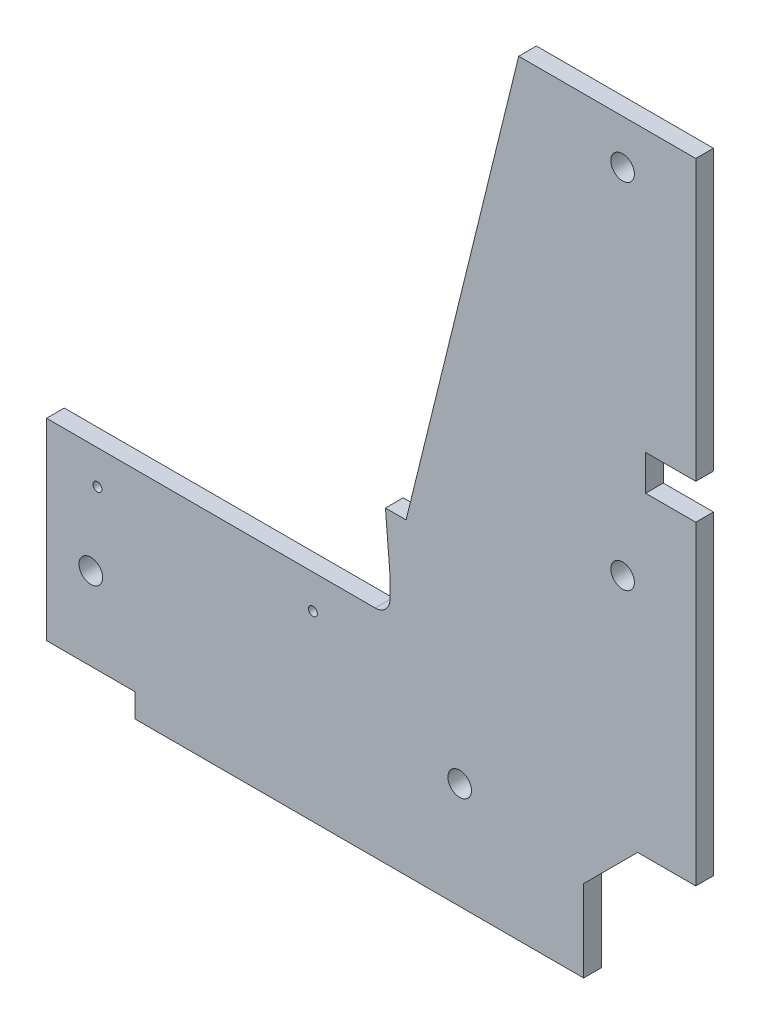
ISO-10303-21;
HEADER;
FILE_DESCRIPTION(('STEP AP214'),'2;1');
FILE_NAME('part.step','',(''),(''),'','','');
FILE_SCHEMA(('AUTOMOTIVE_DESIGN { 1 0 10303 214 1 1 1 1 }'));
ENDSEC;
DATA;
#1=APPLICATION_CONTEXT('core data for automotive mechanical design processes');
#2=APPLICATION_PROTOCOL_DEFINITION('international standard','automotive_design',2000,#1);
#3=PRODUCT_CONTEXT('',#1,'mechanical');
#4=PRODUCT('Part','Part','',(#3));
#5=PRODUCT_RELATED_PRODUCT_CATEGORY('part','',(#4));
#6=PRODUCT_DEFINITION_FORMATION('','',#4);
#7=PRODUCT_DEFINITION_CONTEXT('part definition',#1,'design');
#8=PRODUCT_DEFINITION('design','',#6,#7);
#9=PRODUCT_DEFINITION_SHAPE('','',#8);
#10=(LENGTH_UNIT() NAMED_UNIT(*) SI_UNIT(.MILLI.,.METRE.));
#11=(NAMED_UNIT(*) PLANE_ANGLE_UNIT() SI_UNIT($,.RADIAN.));
#12=(NAMED_UNIT(*) SI_UNIT($,.STERADIAN.) SOLID_ANGLE_UNIT());
#13=UNCERTAINTY_MEASURE_WITH_UNIT(LENGTH_MEASURE(1.E-05),#10,'distance_accuracy_value','');
#14=(GEOMETRIC_REPRESENTATION_CONTEXT(3) GLOBAL_UNCERTAINTY_ASSIGNED_CONTEXT((#13)) GLOBAL_UNIT_ASSIGNED_CONTEXT((#10,
#11,#12)) REPRESENTATION_CONTEXT('',''));
#15=CARTESIAN_POINT('',(0.,0.,0.));
#16=DIRECTION('',(0.,0.,1.));
#17=DIRECTION('',(1.,0.,0.));
#18=AXIS2_PLACEMENT_3D('',#15,#16,#17);
#19=CARTESIAN_POINT('',(0.,259.8,6.));
#20=DIRECTION('',(-1.,0.,0.));
#21=DIRECTION('',(0.,-1.,0.));
#22=AXIS2_PLACEMENT_3D('',#19,#20,#21);
#23=PLANE('',#22);
#24=DIRECTION('',(0.,1.,0.));
#25=VECTOR('',#24,1.);
#26=CARTESIAN_POINT('',(0.,259.8,0.));
#27=LINE('',#26,#25);
#28=CARTESIAN_POINT('',(0.,46.3,0.));
#29=VERTEX_POINT('',#28);
#30=CARTESIAN_POINT('',(0.,153.05,0.));
#31=VERTEX_POINT('',#30);
#32=EDGE_CURVE('E210',#29,#31,#27,.T.);
#33=ORIENTED_EDGE('',*,*,#32,.T.);
#34=DIRECTION('',(0.,0.,1.));
#35=VECTOR('',#34,1.);
#36=CARTESIAN_POINT('',(0.,153.05,-4.));
#37=LINE('',#36,#35);
#38=CARTESIAN_POINT('',(0.,153.05,6.));
#39=VERTEX_POINT('',#38);
#40=EDGE_CURVE('E230',#31,#39,#37,.T.);
#41=ORIENTED_EDGE('',*,*,#40,.T.);
#42=DIRECTION('',(0.,1.,0.));
#43=VECTOR('',#42,1.);
#44=CARTESIAN_POINT('',(0.,259.8,6.));
#45=LINE('',#44,#43);
#46=CARTESIAN_POINT('',(0.,46.3,6.));
#47=VERTEX_POINT('',#46);
#48=EDGE_CURVE('E193',#47,#39,#45,.T.);
#49=ORIENTED_EDGE('',*,*,#48,.F.);
#50=DIRECTION('',(0.,0.,1.));
#51=VECTOR('',#50,1.);
#52=CARTESIAN_POINT('',(0.,46.3,0.));
#53=LINE('',#52,#51);
#54=EDGE_CURVE('E332',#29,#47,#53,.T.);
#55=ORIENTED_EDGE('',*,*,#54,.F.);
#56=EDGE_LOOP('',(#33,#41,#49,#55));
#57=FACE_BOUND('',#56,.T.);
#58=ADVANCED_FACE('F40',(#57),#23,.F.);
#59=CARTESIAN_POINT('',(0.,165.05,6.));
#60=VERTEX_POINT('',#59);
#61=CARTESIAN_POINT('',(0.,259.8,6.));
#62=VERTEX_POINT('',#61);
#63=EDGE_CURVE('E185',#60,#62,#45,.T.);
#64=ORIENTED_EDGE('',*,*,#63,.F.);
#65=DIRECTION('',(0.,0.,1.));
#66=VECTOR('',#65,1.);
#67=CARTESIAN_POINT('',(0.,165.05,-4.));
#68=LINE('',#67,#66);
#69=CARTESIAN_POINT('',(0.,165.05,0.));
#70=VERTEX_POINT('',#69);
#71=EDGE_CURVE('E169',#70,#60,#68,.T.);
#72=ORIENTED_EDGE('',*,*,#71,.F.);
#73=CARTESIAN_POINT('',(0.,259.8,0.));
#74=VERTEX_POINT('',#73);
#75=EDGE_CURVE('E213',#70,#74,#27,.T.);
#76=ORIENTED_EDGE('',*,*,#75,.T.);
#77=DIRECTION('',(0.,0.,-1.));
#78=VECTOR('',#77,1.);
#79=CARTESIAN_POINT('',(0.,259.8,6.));
#80=LINE('',#79,#78);
#81=EDGE_CURVE('E192',#62,#74,#80,.T.);
#82=ORIENTED_EDGE('',*,*,#81,.F.);
#83=EDGE_LOOP('',(#64,#72,#76,#82));
#84=FACE_BOUND('',#83,.T.);
#85=ADVANCED_FACE('F42',(#84),#23,.F.);
#86=CARTESIAN_POINT('',(-60.,259.8,6.));
#87=DIRECTION('',(0.,-1.,0.));
#88=DIRECTION('',(0.,0.,-1.));
#89=AXIS2_PLACEMENT_3D('',#86,#87,#88);
#90=PLANE('',#89);
#91=DIRECTION('',(-1.,0.,0.));
#92=VECTOR('',#91,1.);
#93=CARTESIAN_POINT('',(-60.,259.8,0.));
#94=LINE('',#93,#92);
#95=CARTESIAN_POINT('',(-60.,259.8,0.));
#96=VERTEX_POINT('',#95);
#97=EDGE_CURVE('E199',#74,#96,#94,.T.);
#98=ORIENTED_EDGE('',*,*,#97,.T.);
#99=DIRECTION('',(0.,0.,-1.));
#100=VECTOR('',#99,1.);
#101=CARTESIAN_POINT('',(-60.,259.8,6.));
#102=LINE('',#101,#100);
#103=CARTESIAN_POINT('',(-60.,259.8,6.));
#104=VERTEX_POINT('',#103);
#105=EDGE_CURVE('E209',#104,#96,#102,.T.);
#106=ORIENTED_EDGE('',*,*,#105,.F.);
#107=DIRECTION('',(-1.,0.,0.));
#108=VECTOR('',#107,1.);
#109=CARTESIAN_POINT('',(-60.,259.8,6.));
#110=LINE('',#109,#108);
#111=EDGE_CURVE('E197',#62,#104,#110,.T.);
#112=ORIENTED_EDGE('',*,*,#111,.F.);
#113=ORIENTED_EDGE('',*,*,#81,.T.);
#114=EDGE_LOOP('',(#98,#106,#112,#113));
#115=FACE_BOUND('',#114,.T.);
#116=ADVANCED_FACE('F414',(#115),#90,.F.);
#117=CARTESIAN_POINT('',(-220.,0.,6.));
#118=DIRECTION('',(1.,0.,0.));
#119=DIRECTION('',(0.,0.,-1.));
#120=AXIS2_PLACEMENT_3D('',#117,#118,#119);
#121=PLANE('',#120);
#122=DIRECTION('',(0.,-1.,0.));
#123=VECTOR('',#122,1.);
#124=CARTESIAN_POINT('',(-220.,0.,0.));
#125=LINE('',#124,#123);
#126=CARTESIAN_POINT('',(-220.,73.57,0.));
#127=VERTEX_POINT('',#126);
#128=CARTESIAN_POINT('',(-220.,8.29999999999997,0.));
#129=VERTEX_POINT('',#128);
#130=EDGE_CURVE('E194',#127,#129,#125,.T.);
#131=ORIENTED_EDGE('',*,*,#130,.T.);
#132=DIRECTION('',(0.,0.,1.));
#133=VECTOR('',#132,1.);
#134=CARTESIAN_POINT('',(-220.,8.29999999999997,0.));
#135=LINE('',#134,#133);
#136=CARTESIAN_POINT('',(-220.,8.29999999999997,6.));
#137=VERTEX_POINT('',#136);
#138=EDGE_CURVE('E363',#129,#137,#135,.T.);
#139=ORIENTED_EDGE('',*,*,#138,.T.);
#140=DIRECTION('',(0.,-1.,0.));
#141=VECTOR('',#140,1.);
#142=CARTESIAN_POINT('',(-220.,0.,6.));
#143=LINE('',#142,#141);
#144=CARTESIAN_POINT('',(-220.,73.57,6.));
#145=VERTEX_POINT('',#144);
#146=EDGE_CURVE('E206',#145,#137,#143,.T.);
#147=ORIENTED_EDGE('',*,*,#146,.F.);
#148=DIRECTION('',(0.,0.,1.));
#149=VECTOR('',#148,1.);
#150=CARTESIAN_POINT('',(-220.,73.57,0.));
#151=LINE('',#150,#149);
#152=EDGE_CURVE('E296',#127,#145,#151,.T.);
#153=ORIENTED_EDGE('',*,*,#152,.F.);
#154=EDGE_LOOP('',(#131,#139,#147,#153));
#155=FACE_BOUND('',#154,.T.);
#156=ADVANCED_FACE('F378',(#155),#121,.F.);
#157=CARTESIAN_POINT('',(-116.389393610517,86.3461185088257,6.));
#158=DIRECTION('',(0.,0.,1.));
#159=DIRECTION('',(1.,0.,0.));
#160=AXIS2_PLACEMENT_3D('',#157,#158,#159);
#161=PLANE('',#160);
#162=DIRECTION('',(1.,0.,0.));
#163=VECTOR('',#162,1.);
#164=CARTESIAN_POINT('',(0.,153.05,6.));
#165=LINE('',#164,#163);
#166=CARTESIAN_POINT('',(-17.,153.05,6.));
#167=VERTEX_POINT('',#166);
#168=EDGE_CURVE('E179',#167,#39,#165,.T.);
#169=ORIENTED_EDGE('',*,*,#168,.F.);
#170=DIRECTION('',(0.,-1.,0.));
#171=VECTOR('',#170,1.);
#172=CARTESIAN_POINT('',(-17.,153.05,6.));
#173=LINE('',#172,#171);
#174=CARTESIAN_POINT('',(-17.,165.05,6.));
#175=VERTEX_POINT('',#174);
#176=EDGE_CURVE('E188',#175,#167,#173,.T.);
#177=ORIENTED_EDGE('',*,*,#176,.F.);
#178=DIRECTION('',(-1.,0.,0.));
#179=VECTOR('',#178,1.);
#180=CARTESIAN_POINT('',(0.,165.05,6.));
#181=LINE('',#180,#179);
#182=EDGE_CURVE('E172',#60,#175,#181,.T.);
#183=ORIENTED_EDGE('',*,*,#182,.F.);
#184=ORIENTED_EDGE('',*,*,#63,.T.);
#185=ORIENTED_EDGE('',*,*,#111,.T.);
#186=DIRECTION('',(-0.238808353863482,-0.971066717648697,0.));
#187=VECTOR('',#186,1.);
#188=CARTESIAN_POINT('',(-103.412279577948,83.272591501112,6.));
#189=LINE('',#188,#187);
#190=CARTESIAN_POINT('',(-98.1575266786795,104.64,6.));
#191=VERTEX_POINT('',#190);
#192=EDGE_CURVE('E317',#104,#191,#189,.T.);
#193=ORIENTED_EDGE('',*,*,#192,.T.);
#194=DIRECTION('',(-1.,0.,0.));
#195=VECTOR('',#194,1.);
#196=CARTESIAN_POINT('',(-98.1575266786795,104.64,6.));
#197=LINE('',#196,#195);
#198=CARTESIAN_POINT('',(-105.154959957925,104.64,6.));
#199=VERTEX_POINT('',#198);
#200=EDGE_CURVE('E301',#191,#199,#197,.T.);
#201=ORIENTED_EDGE('',*,*,#200,.T.);
#202=DIRECTION('',(0.0812879696273212,-0.996690657121791,0.));
#203=VECTOR('',#202,1.);
#204=CARTESIAN_POINT('',(-105.,102.74,6.));
#205=LINE('',#204,#203);
#206=CARTESIAN_POINT('',(-103.622774873519,85.8535231620348,6.));
#207=VERTEX_POINT('',#206);
#208=EDGE_CURVE('E311',#199,#207,#205,.T.);
#209=ORIENTED_EDGE('',*,*,#208,.T.);
#210=DIRECTION('',(0.,1.,0.));
#211=VECTOR('',#210,1.);
#212=CARTESIAN_POINT('',(-103.622774873519,85.8535231620348,6.));
#213=LINE('',#212,#211);
#214=CARTESIAN_POINT('',(-103.622774873519,78.57,6.));
#215=VERTEX_POINT('',#214);
#216=EDGE_CURVE('E266',#215,#207,#213,.T.);
#217=ORIENTED_EDGE('',*,*,#216,.F.);
#218=CARTESIAN_POINT('',(-108.622774873519,78.57,6.));
#219=DIRECTION('',(0.,0.,1.));
#220=DIRECTION('',(1.,0.,0.));
#221=AXIS2_PLACEMENT_3D('',#218,#219,#220);
#222=CIRCLE('',#221,5.);
#223=CARTESIAN_POINT('',(-108.622774873519,73.57,6.));
#224=VERTEX_POINT('',#223);
#225=EDGE_CURVE('E261',#224,#215,#222,.T.);
#226=ORIENTED_EDGE('',*,*,#225,.F.);
#227=DIRECTION('',(-1.,0.,0.));
#228=VECTOR('',#227,1.);
#229=CARTESIAN_POINT('',(-220.,73.57,6.));
#230=LINE('',#229,#228);
#231=EDGE_CURVE('E292',#224,#145,#230,.T.);
#232=ORIENTED_EDGE('',*,*,#231,.T.);
#233=ORIENTED_EDGE('',*,*,#146,.T.);
#234=DIRECTION('',(-1.,0.,0.));
#235=VECTOR('',#234,1.);
#236=CARTESIAN_POINT('',(-220.,8.29999999999997,6.));
#237=LINE('',#236,#235);
#238=CARTESIAN_POINT('',(-190.,8.29999999999997,6.));
#239=VERTEX_POINT('',#238);
#240=EDGE_CURVE('E359',#239,#137,#237,.T.);
#241=ORIENTED_EDGE('',*,*,#240,.F.);
#242=DIRECTION('',(0.,1.,0.));
#243=VECTOR('',#242,1.);
#244=CARTESIAN_POINT('',(-190.,0.,6.));
#245=LINE('',#244,#243);
#246=CARTESIAN_POINT('',(-190.,0.299999999999973,6.));
#247=VERTEX_POINT('',#246);
#248=EDGE_CURVE('E347',#247,#239,#245,.T.);
#249=ORIENTED_EDGE('',*,*,#248,.F.);
#250=DIRECTION('',(-1.,0.,0.));
#251=VECTOR('',#250,1.);
#252=CARTESIAN_POINT('',(-190.,0.299999999999973,6.));
#253=LINE('',#252,#251);
#254=CARTESIAN_POINT('',(-38.,0.299999999999973,6.));
#255=VERTEX_POINT('',#254);
#256=EDGE_CURVE('E253',#255,#247,#253,.T.);
#257=ORIENTED_EDGE('',*,*,#256,.F.);
#258=DIRECTION('',(0.,-1.,0.));
#259=VECTOR('',#258,1.);
#260=CARTESIAN_POINT('',(-38.,0.,6.));
#261=LINE('',#260,#259);
#262=CARTESIAN_POINT('',(-38.,28.,6.));
#263=VERTEX_POINT('',#262);
#264=EDGE_CURVE('E329',#263,#255,#261,.T.);
#265=ORIENTED_EDGE('',*,*,#264,.F.);
#266=DIRECTION('',(-0.707106781186547,-0.707106781186548,0.));
#267=VECTOR('',#266,1.);
#268=CARTESIAN_POINT('',(-38.,28.,6.));
#269=LINE('',#268,#267);
#270=CARTESIAN_POINT('',(-19.7,46.3,6.));
#271=VERTEX_POINT('',#270);
#272=EDGE_CURVE('E241',#271,#263,#269,.T.);
#273=ORIENTED_EDGE('',*,*,#272,.F.);
#274=DIRECTION('',(-1.,0.,0.));
#275=VECTOR('',#274,1.);
#276=CARTESIAN_POINT('',(-10.7,46.3,6.));
#277=LINE('',#276,#275);
#278=EDGE_CURVE('E323',#47,#271,#277,.T.);
#279=ORIENTED_EDGE('',*,*,#278,.F.);
#280=ORIENTED_EDGE('',*,*,#48,.T.);
#281=EDGE_LOOP('',(#169,#177,#183,#184,#185,#193,#201,#209,#217,#226,#232,#233,#241,#249,#257,
#265,#273,#279,#280));
#282=FACE_BOUND('',#281,.T.);
#283=CARTESIAN_POINT('',(-80.,36.3,6.));
#284=DIRECTION('',(0.,0.,1.));
#285=DIRECTION('',(1.,0.,0.));
#286=AXIS2_PLACEMENT_3D('',#283,#284,#285);
#287=CIRCLE('',#286,3.99999999999999);
#288=CARTESIAN_POINT('',(-76.,36.3,6.));
#289=VERTEX_POINT('',#288);
#290=EDGE_CURVE('E233',#289,#289,#287,.T.);
#291=ORIENTED_EDGE('',*,*,#290,.F.);
#292=EDGE_LOOP('',(#291));
#293=FACE_BOUND('',#292,.T.);
#294=CARTESIAN_POINT('',(-202.75,62.07,6.));
#295=DIRECTION('',(0.,0.,1.));
#296=DIRECTION('',(1.,0.,0.));
#297=AXIS2_PLACEMENT_3D('',#294,#295,#296);
#298=CIRCLE('',#297,1.5);
#299=CARTESIAN_POINT('',(-201.25,62.07,6.));
#300=VERTEX_POINT('',#299);
#301=EDGE_CURVE('E282',#300,#300,#298,.T.);
#302=ORIENTED_EDGE('',*,*,#301,.F.);
#303=EDGE_LOOP('',(#302));
#304=FACE_BOUND('',#303,.T.);
#305=CARTESIAN_POINT('',(-129.75,62.07,6.));
#306=DIRECTION('',(0.,0.,1.));
#307=DIRECTION('',(1.,0.,0.));
#308=AXIS2_PLACEMENT_3D('',#305,#306,#307);
#309=CIRCLE('',#308,1.5);
#310=CARTESIAN_POINT('',(-128.25,62.07,6.));
#311=VERTEX_POINT('',#310);
#312=EDGE_CURVE('E275',#311,#311,#309,.T.);
#313=ORIENTED_EDGE('',*,*,#312,.F.);
#314=EDGE_LOOP('',(#313));
#315=FACE_BOUND('',#314,.T.);
#316=CARTESIAN_POINT('',(-24.8,125.,6.));
#317=DIRECTION('',(0.,0.,1.));
#318=DIRECTION('',(1.,0.,0.));
#319=AXIS2_PLACEMENT_3D('',#316,#317,#318);
#320=CIRCLE('',#319,4.00000000000001);
#321=CARTESIAN_POINT('',(-20.8,125.,6.));
#322=VERTEX_POINT('',#321);
#323=EDGE_CURVE('E337',#322,#322,#320,.T.);
#324=ORIENTED_EDGE('',*,*,#323,.F.);
#325=EDGE_LOOP('',(#324));
#326=FACE_BOUND('',#325,.T.);
#327=CARTESIAN_POINT('',(-24.8,244.8,6.));
#328=DIRECTION('',(0.,0.,1.));
#329=DIRECTION('',(1.,0.,0.));
#330=AXIS2_PLACEMENT_3D('',#327,#328,#329);
#331=CIRCLE('',#330,4.00000000000001);
#332=CARTESIAN_POINT('',(-20.8,244.8,6.));
#333=VERTEX_POINT('',#332);
#334=EDGE_CURVE('E341',#333,#333,#331,.T.);
#335=ORIENTED_EDGE('',*,*,#334,.F.);
#336=EDGE_LOOP('',(#335));
#337=FACE_BOUND('',#336,.T.);
#338=CARTESIAN_POINT('',(-205.,36.3,6.));
#339=DIRECTION('',(0.,0.,1.));
#340=DIRECTION('',(1.,0.,0.));
#341=AXIS2_PLACEMENT_3D('',#338,#339,#340);
#342=CIRCLE('',#341,3.99999999999999);
#343=CARTESIAN_POINT('',(-201.,36.3,6.));
#344=VERTEX_POINT('',#343);
#345=EDGE_CURVE('E348',#344,#344,#342,.T.);
#346=ORIENTED_EDGE('',*,*,#345,.F.);
#347=EDGE_LOOP('',(#346));
#348=FACE_BOUND('',#347,.T.);
#349=ADVANCED_FACE('F183',(#282,#293,#304,#315,#326,#337,#348),#161,.T.);
#350=CARTESIAN_POINT('',(-116.389393610517,86.3461185088257,0.));
#351=DIRECTION('',(0.,0.,1.));
#352=DIRECTION('',(1.,0.,0.));
#353=AXIS2_PLACEMENT_3D('',#350,#351,#352);
#354=PLANE('',#353);
#355=CARTESIAN_POINT('',(-202.75,62.07,0.));
#356=DIRECTION('',(0.,0.,1.));
#357=DIRECTION('',(1.,0.,0.));
#358=AXIS2_PLACEMENT_3D('',#355,#356,#357);
#359=CIRCLE('',#358,1.5);
#360=CARTESIAN_POINT('',(-201.25,62.07,0.));
#361=VERTEX_POINT('',#360);
#362=EDGE_CURVE('E278',#361,#361,#359,.T.);
#363=ORIENTED_EDGE('',*,*,#362,.T.);
#364=EDGE_LOOP('',(#363));
#365=FACE_BOUND('',#364,.T.);
#366=CARTESIAN_POINT('',(-129.75,62.07,0.));
#367=DIRECTION('',(0.,0.,1.));
#368=DIRECTION('',(1.,0.,0.));
#369=AXIS2_PLACEMENT_3D('',#366,#367,#368);
#370=CIRCLE('',#369,1.5);
#371=CARTESIAN_POINT('',(-128.25,62.07,0.));
#372=VERTEX_POINT('',#371);
#373=EDGE_CURVE('E285',#372,#372,#370,.T.);
#374=ORIENTED_EDGE('',*,*,#373,.T.);
#375=EDGE_LOOP('',(#374));
#376=FACE_BOUND('',#375,.T.);
#377=DIRECTION('',(0.,-1.,0.));
#378=VECTOR('',#377,1.);
#379=CARTESIAN_POINT('',(-17.,86.3461185088257,0.));
#380=LINE('',#379,#378);
#381=CARTESIAN_POINT('',(-17.,165.05,0.));
#382=VERTEX_POINT('',#381);
#383=CARTESIAN_POINT('',(-17.,153.05,0.));
#384=VERTEX_POINT('',#383);
#385=EDGE_CURVE('E48',#382,#384,#380,.T.);
#386=ORIENTED_EDGE('',*,*,#385,.T.);
#387=DIRECTION('',(1.,0.,0.));
#388=VECTOR('',#387,1.);
#389=CARTESIAN_POINT('',(-116.389393610517,153.05,0.));
#390=LINE('',#389,#388);
#391=EDGE_CURVE('E11',#384,#31,#390,.T.);
#392=ORIENTED_EDGE('',*,*,#391,.T.);
#393=ORIENTED_EDGE('',*,*,#32,.F.);
#394=DIRECTION('',(-1.,0.,0.));
#395=VECTOR('',#394,1.);
#396=CARTESIAN_POINT('',(-10.7,46.3,0.));
#397=LINE('',#396,#395);
#398=CARTESIAN_POINT('',(-19.7,46.3,0.));
#399=VERTEX_POINT('',#398);
#400=EDGE_CURVE('E326',#29,#399,#397,.T.);
#401=ORIENTED_EDGE('',*,*,#400,.T.);
#402=DIRECTION('',(-0.707106781186547,-0.707106781186548,0.));
#403=VECTOR('',#402,1.);
#404=CARTESIAN_POINT('',(-38.,28.,0.));
#405=LINE('',#404,#403);
#406=CARTESIAN_POINT('',(-38.,28.,0.));
#407=VERTEX_POINT('',#406);
#408=EDGE_CURVE('E244',#399,#407,#405,.T.);
#409=ORIENTED_EDGE('',*,*,#408,.T.);
#410=DIRECTION('',(0.,-1.,0.));
#411=VECTOR('',#410,1.);
#412=CARTESIAN_POINT('',(-38.,0.,0.));
#413=LINE('',#412,#411);
#414=CARTESIAN_POINT('',(-38.,0.299999999999973,0.));
#415=VERTEX_POINT('',#414);
#416=EDGE_CURVE('E328',#407,#415,#413,.T.);
#417=ORIENTED_EDGE('',*,*,#416,.T.);
#418=DIRECTION('',(-1.,0.,0.));
#419=VECTOR('',#418,1.);
#420=CARTESIAN_POINT('',(-116.389393610517,0.299999999999967,0.));
#421=LINE('',#420,#419);
#422=CARTESIAN_POINT('',(-190.,0.299999999999973,0.));
#423=VERTEX_POINT('',#422);
#424=EDGE_CURVE('E63',#415,#423,#421,.T.);
#425=ORIENTED_EDGE('',*,*,#424,.T.);
#426=DIRECTION('',(0.,1.,0.));
#427=VECTOR('',#426,1.);
#428=CARTESIAN_POINT('',(-190.,0.,0.));
#429=LINE('',#428,#427);
#430=CARTESIAN_POINT('',(-190.,8.29999999999997,0.));
#431=VERTEX_POINT('',#430);
#432=EDGE_CURVE('E356',#423,#431,#429,.T.);
#433=ORIENTED_EDGE('',*,*,#432,.T.);
#434=DIRECTION('',(-1.,0.,0.));
#435=VECTOR('',#434,1.);
#436=CARTESIAN_POINT('',(-220.,8.29999999999997,0.));
#437=LINE('',#436,#435);
#438=EDGE_CURVE('E358',#431,#129,#437,.T.);
#439=ORIENTED_EDGE('',*,*,#438,.T.);
#440=ORIENTED_EDGE('',*,*,#130,.F.);
#441=DIRECTION('',(-1.,0.,0.));
#442=VECTOR('',#441,1.);
#443=CARTESIAN_POINT('',(-220.,73.57,0.));
#444=LINE('',#443,#442);
#445=CARTESIAN_POINT('',(-108.622774873519,73.57,0.));
#446=VERTEX_POINT('',#445);
#447=EDGE_CURVE('E293',#446,#127,#444,.T.);
#448=ORIENTED_EDGE('',*,*,#447,.F.);
#449=CARTESIAN_POINT('',(-108.622774873519,78.57,0.));
#450=DIRECTION('',(0.,0.,1.));
#451=DIRECTION('',(1.,0.,0.));
#452=AXIS2_PLACEMENT_3D('',#449,#450,#451);
#453=CIRCLE('',#452,5.);
#454=CARTESIAN_POINT('',(-103.622774873519,78.57,0.));
#455=VERTEX_POINT('',#454);
#456=EDGE_CURVE('E262',#446,#455,#453,.T.);
#457=ORIENTED_EDGE('',*,*,#456,.T.);
#458=DIRECTION('',(0.,1.,0.));
#459=VECTOR('',#458,1.);
#460=CARTESIAN_POINT('',(-103.622774873519,85.8535231620348,0.));
#461=LINE('',#460,#459);
#462=CARTESIAN_POINT('',(-103.622774873519,85.8535231620348,0.));
#463=VERTEX_POINT('',#462);
#464=EDGE_CURVE('E265',#455,#463,#461,.T.);
#465=ORIENTED_EDGE('',*,*,#464,.T.);
#466=DIRECTION('',(0.0812879696273212,-0.996690657121791,0.));
#467=VECTOR('',#466,1.);
#468=CARTESIAN_POINT('',(-105.,102.74,0.));
#469=LINE('',#468,#467);
#470=CARTESIAN_POINT('',(-105.154959957925,104.64,0.));
#471=VERTEX_POINT('',#470);
#472=EDGE_CURVE('E314',#471,#463,#469,.T.);
#473=ORIENTED_EDGE('',*,*,#472,.F.);
#474=DIRECTION('',(-1.,0.,0.));
#475=VECTOR('',#474,1.);
#476=CARTESIAN_POINT('',(-98.1575266786795,104.64,0.));
#477=LINE('',#476,#475);
#478=CARTESIAN_POINT('',(-98.1575266786795,104.64,0.));
#479=VERTEX_POINT('',#478);
#480=EDGE_CURVE('E302',#479,#471,#477,.T.);
#481=ORIENTED_EDGE('',*,*,#480,.F.);
#482=DIRECTION('',(-0.238808353863482,-0.971066717648697,0.));
#483=VECTOR('',#482,1.);
#484=CARTESIAN_POINT('',(-103.412279577948,83.272591501112,0.));
#485=LINE('',#484,#483);
#486=EDGE_CURVE('E320',#96,#479,#485,.T.);
#487=ORIENTED_EDGE('',*,*,#486,.F.);
#488=ORIENTED_EDGE('',*,*,#97,.F.);
#489=ORIENTED_EDGE('',*,*,#75,.F.);
#490=DIRECTION('',(-1.,0.,0.));
#491=VECTOR('',#490,1.);
#492=CARTESIAN_POINT('',(-116.389393610517,165.05,0.));
#493=LINE('',#492,#491);
#494=EDGE_CURVE('E175',#70,#382,#493,.T.);
#495=ORIENTED_EDGE('',*,*,#494,.T.);
#496=EDGE_LOOP('',(#386,#392,#393,#401,#409,#417,#425,#433,#439,#440,#448,#457,#465,#473,#481,
#487,#488,#489,#495));
#497=FACE_BOUND('',#496,.T.);
#498=CARTESIAN_POINT('',(-80.,36.3,0.));
#499=DIRECTION('',(0.,0.,1.));
#500=DIRECTION('',(1.,0.,0.));
#501=AXIS2_PLACEMENT_3D('',#498,#499,#500);
#502=CIRCLE('',#501,3.99999999999999);
#503=CARTESIAN_POINT('',(-76.,36.3,0.));
#504=VERTEX_POINT('',#503);
#505=EDGE_CURVE('E238',#504,#504,#502,.T.);
#506=ORIENTED_EDGE('',*,*,#505,.T.);
#507=EDGE_LOOP('',(#506));
#508=FACE_BOUND('',#507,.T.);
#509=CARTESIAN_POINT('',(-24.8,125.,0.));
#510=DIRECTION('',(0.,0.,1.));
#511=DIRECTION('',(1.,0.,0.));
#512=AXIS2_PLACEMENT_3D('',#509,#510,#511);
#513=CIRCLE('',#512,4.00000000000001);
#514=CARTESIAN_POINT('',(-20.8,125.,0.));
#515=VERTEX_POINT('',#514);
#516=EDGE_CURVE('E338',#515,#515,#513,.T.);
#517=ORIENTED_EDGE('',*,*,#516,.T.);
#518=EDGE_LOOP('',(#517));
#519=FACE_BOUND('',#518,.T.);
#520=CARTESIAN_POINT('',(-24.8,244.8,0.));
#521=DIRECTION('',(0.,0.,1.));
#522=DIRECTION('',(1.,0.,0.));
#523=AXIS2_PLACEMENT_3D('',#520,#521,#522);
#524=CIRCLE('',#523,4.00000000000001);
#525=CARTESIAN_POINT('',(-20.8,244.8,0.));
#526=VERTEX_POINT('',#525);
#527=EDGE_CURVE('E351',#526,#526,#524,.T.);
#528=ORIENTED_EDGE('',*,*,#527,.T.);
#529=EDGE_LOOP('',(#528));
#530=FACE_BOUND('',#529,.T.);
#531=CARTESIAN_POINT('',(-205.,36.3,0.));
#532=DIRECTION('',(0.,0.,1.));
#533=DIRECTION('',(1.,0.,0.));
#534=AXIS2_PLACEMENT_3D('',#531,#532,#533);
#535=CIRCLE('',#534,3.99999999999999);
#536=CARTESIAN_POINT('',(-201.,36.3,0.));
#537=VERTEX_POINT('',#536);
#538=EDGE_CURVE('E344',#537,#537,#535,.T.);
#539=ORIENTED_EDGE('',*,*,#538,.T.);
#540=EDGE_LOOP('',(#539));
#541=FACE_BOUND('',#540,.T.);
#542=ADVANCED_FACE('F222',(#365,#376,#497,#508,#519,#530,#541),#354,.F.);
#543=CARTESIAN_POINT('',(-220.,8.29999999999997,0.));
#544=DIRECTION('',(0.,1.,0.));
#545=DIRECTION('',(0.,0.,1.));
#546=AXIS2_PLACEMENT_3D('',#543,#544,#545);
#547=PLANE('',#546);
#548=ORIENTED_EDGE('',*,*,#240,.T.);
#549=ORIENTED_EDGE('',*,*,#138,.F.);
#550=ORIENTED_EDGE('',*,*,#438,.F.);
#551=DIRECTION('',(0.,0.,1.));
#552=VECTOR('',#551,1.);
#553=CARTESIAN_POINT('',(-190.,8.29999999999997,0.));
#554=LINE('',#553,#552);
#555=EDGE_CURVE('E203',#431,#239,#554,.T.);
#556=ORIENTED_EDGE('',*,*,#555,.T.);
#557=EDGE_LOOP('',(#548,#549,#550,#556));
#558=FACE_BOUND('',#557,.T.);
#559=ADVANCED_FACE('F371',(#558),#547,.F.);
#560=CARTESIAN_POINT('',(-190.,0.,0.));
#561=DIRECTION('',(1.,0.,0.));
#562=DIRECTION('',(0.,0.,-1.));
#563=AXIS2_PLACEMENT_3D('',#560,#561,#562);
#564=PLANE('',#563);
#565=ORIENTED_EDGE('',*,*,#432,.F.);
#566=DIRECTION('',(0.,0.,1.));
#567=VECTOR('',#566,1.);
#568=CARTESIAN_POINT('',(-190.,0.299999999999973,-4.));
#569=LINE('',#568,#567);
#570=EDGE_CURVE('E257',#423,#247,#569,.T.);
#571=ORIENTED_EDGE('',*,*,#570,.T.);
#572=ORIENTED_EDGE('',*,*,#248,.T.);
#573=ORIENTED_EDGE('',*,*,#555,.F.);
#574=EDGE_LOOP('',(#565,#571,#572,#573));
#575=FACE_BOUND('',#574,.T.);
#576=ADVANCED_FACE('F383',(#575),#564,.F.);
#577=CARTESIAN_POINT('',(-38.,0.,0.));
#578=DIRECTION('',(-1.,0.,0.));
#579=DIRECTION('',(0.,-1.,0.));
#580=AXIS2_PLACEMENT_3D('',#577,#578,#579);
#581=PLANE('',#580);
#582=ORIENTED_EDGE('',*,*,#264,.T.);
#583=DIRECTION('',(0.,0.,-1.));
#584=VECTOR('',#583,1.);
#585=CARTESIAN_POINT('',(-38.,0.299999999999973,0.));
#586=LINE('',#585,#584);
#587=EDGE_CURVE('E218',#255,#415,#586,.T.);
#588=ORIENTED_EDGE('',*,*,#587,.T.);
#589=ORIENTED_EDGE('',*,*,#416,.F.);
#590=DIRECTION('',(0.,0.,1.));
#591=VECTOR('',#590,1.);
#592=CARTESIAN_POINT('',(-38.,28.,0.));
#593=LINE('',#592,#591);
#594=EDGE_CURVE('E250',#407,#263,#593,.T.);
#595=ORIENTED_EDGE('',*,*,#594,.T.);
#596=EDGE_LOOP('',(#582,#588,#589,#595));
#597=FACE_BOUND('',#596,.T.);
#598=ADVANCED_FACE('F387',(#597),#581,.F.);
#599=CARTESIAN_POINT('',(-10.7,46.3,0.));
#600=DIRECTION('',(0.,1.,0.));
#601=DIRECTION('',(0.,0.,1.));
#602=AXIS2_PLACEMENT_3D('',#599,#600,#601);
#603=PLANE('',#602);
#604=ORIENTED_EDGE('',*,*,#278,.T.);
#605=DIRECTION('',(0.,0.,1.));
#606=VECTOR('',#605,1.);
#607=CARTESIAN_POINT('',(-19.7,46.3,0.));
#608=LINE('',#607,#606);
#609=EDGE_CURVE('E247',#399,#271,#608,.T.);
#610=ORIENTED_EDGE('',*,*,#609,.F.);
#611=ORIENTED_EDGE('',*,*,#400,.F.);
#612=ORIENTED_EDGE('',*,*,#54,.T.);
#613=EDGE_LOOP('',(#604,#610,#611,#612));
#614=FACE_BOUND('',#613,.T.);
#615=ADVANCED_FACE('F441',(#614),#603,.F.);
#616=CARTESIAN_POINT('',(-205.,36.3,0.));
#617=DIRECTION('',(0.,0.,1.));
#618=DIRECTION('',(1.,0.,0.));
#619=AXIS2_PLACEMENT_3D('',#616,#617,#618);
#620=CYLINDRICAL_SURFACE('',#619,3.99999999999999);
#621=ORIENTED_EDGE('',*,*,#538,.F.);
#622=EDGE_LOOP('',(#621));
#623=FACE_BOUND('',#622,.T.);
#624=ORIENTED_EDGE('',*,*,#345,.T.);
#625=EDGE_LOOP('',(#624));
#626=FACE_BOUND('',#625,.T.);
#627=ADVANCED_FACE('F437',(#623,#626),#620,.F.);
#628=CARTESIAN_POINT('',(-24.8,244.8,0.));
#629=DIRECTION('',(0.,0.,1.));
#630=DIRECTION('',(1.,0.,0.));
#631=AXIS2_PLACEMENT_3D('',#628,#629,#630);
#632=CYLINDRICAL_SURFACE('',#631,4.00000000000001);
#633=ORIENTED_EDGE('',*,*,#527,.F.);
#634=EDGE_LOOP('',(#633));
#635=FACE_BOUND('',#634,.T.);
#636=ORIENTED_EDGE('',*,*,#334,.T.);
#637=EDGE_LOOP('',(#636));
#638=FACE_BOUND('',#637,.T.);
#639=ADVANCED_FACE('F433',(#635,#638),#632,.F.);
#640=CARTESIAN_POINT('',(-24.8,125.,0.));
#641=DIRECTION('',(0.,0.,1.));
#642=DIRECTION('',(1.,0.,0.));
#643=AXIS2_PLACEMENT_3D('',#640,#641,#642);
#644=CYLINDRICAL_SURFACE('',#643,4.00000000000001);
#645=ORIENTED_EDGE('',*,*,#516,.F.);
#646=EDGE_LOOP('',(#645));
#647=FACE_BOUND('',#646,.T.);
#648=ORIENTED_EDGE('',*,*,#323,.T.);
#649=EDGE_LOOP('',(#648));
#650=FACE_BOUND('',#649,.T.);
#651=ADVANCED_FACE('F436',(#647,#650),#644,.F.);
#652=CARTESIAN_POINT('',(-103.412279577948,83.272591501112,0.));
#653=DIRECTION('',(-0.971066717648697,0.238808353863482,0.));
#654=DIRECTION('',(-0.238808353863482,-0.971066717648697,0.));
#655=AXIS2_PLACEMENT_3D('',#652,#653,#654);
#656=PLANE('',#655);
#657=DIRECTION('',(0.,0.,1.));
#658=VECTOR('',#657,1.);
#659=CARTESIAN_POINT('',(-98.1575266786795,104.64,0.));
#660=LINE('',#659,#658);
#661=EDGE_CURVE('E305',#479,#191,#660,.T.);
#662=ORIENTED_EDGE('',*,*,#661,.T.);
#663=ORIENTED_EDGE('',*,*,#192,.F.);
#664=ORIENTED_EDGE('',*,*,#105,.T.);
#665=ORIENTED_EDGE('',*,*,#486,.T.);
#666=EDGE_LOOP('',(#662,#663,#664,#665));
#667=FACE_BOUND('',#666,.T.);
#668=ADVANCED_FACE('F445',(#667),#656,.T.);
#669=CARTESIAN_POINT('',(-105.,102.74,0.));
#670=DIRECTION('',(-0.996690657121791,-0.0812879696273212,0.));
#671=DIRECTION('',(0.0812879696273213,-0.996690657121791,0.));
#672=AXIS2_PLACEMENT_3D('',#669,#670,#671);
#673=PLANE('',#672);
#674=DIRECTION('',(0.,0.,1.));
#675=VECTOR('',#674,1.);
#676=CARTESIAN_POINT('',(-103.622774873519,85.8535231620348,0.));
#677=LINE('',#676,#675);
#678=EDGE_CURVE('E281',#463,#207,#677,.T.);
#679=ORIENTED_EDGE('',*,*,#678,.T.);
#680=ORIENTED_EDGE('',*,*,#208,.F.);
#681=DIRECTION('',(0.,0.,1.));
#682=VECTOR('',#681,1.);
#683=CARTESIAN_POINT('',(-105.154959957925,104.64,0.));
#684=LINE('',#683,#682);
#685=EDGE_CURVE('E308',#471,#199,#684,.T.);
#686=ORIENTED_EDGE('',*,*,#685,.F.);
#687=ORIENTED_EDGE('',*,*,#472,.T.);
#688=EDGE_LOOP('',(#679,#680,#686,#687));
#689=FACE_BOUND('',#688,.T.);
#690=ADVANCED_FACE('F453',(#689),#673,.T.);
#691=CARTESIAN_POINT('',(-98.1575266786795,104.64,0.));
#692=DIRECTION('',(0.,1.,0.));
#693=DIRECTION('',(-1.,0.,0.));
#694=AXIS2_PLACEMENT_3D('',#691,#692,#693);
#695=PLANE('',#694);
#696=ORIENTED_EDGE('',*,*,#200,.F.);
#697=ORIENTED_EDGE('',*,*,#661,.F.);
#698=ORIENTED_EDGE('',*,*,#480,.T.);
#699=ORIENTED_EDGE('',*,*,#685,.T.);
#700=EDGE_LOOP('',(#696,#697,#698,#699));
#701=FACE_BOUND('',#700,.T.);
#702=ADVANCED_FACE('F457',(#701),#695,.T.);
#703=CARTESIAN_POINT('',(-220.,73.57,0.));
#704=DIRECTION('',(0.,1.,0.));
#705=DIRECTION('',(0.,0.,1.));
#706=AXIS2_PLACEMENT_3D('',#703,#704,#705);
#707=PLANE('',#706);
#708=ORIENTED_EDGE('',*,*,#231,.F.);
#709=DIRECTION('',(0.,0.,1.));
#710=VECTOR('',#709,1.);
#711=CARTESIAN_POINT('',(-108.622774873519,73.57,0.));
#712=LINE('',#711,#710);
#713=EDGE_CURVE('E269',#446,#224,#712,.T.);
#714=ORIENTED_EDGE('',*,*,#713,.F.);
#715=ORIENTED_EDGE('',*,*,#447,.T.);
#716=ORIENTED_EDGE('',*,*,#152,.T.);
#717=EDGE_LOOP('',(#708,#714,#715,#716));
#718=FACE_BOUND('',#717,.T.);
#719=ADVANCED_FACE('F380',(#718),#707,.T.);
#720=CARTESIAN_POINT('',(-129.75,62.07,0.));
#721=DIRECTION('',(0.,0.,1.));
#722=DIRECTION('',(1.,0.,0.));
#723=AXIS2_PLACEMENT_3D('',#720,#721,#722);
#724=CYLINDRICAL_SURFACE('',#723,1.5);
#725=ORIENTED_EDGE('',*,*,#373,.F.);
#726=EDGE_LOOP('',(#725));
#727=FACE_BOUND('',#726,.T.);
#728=ORIENTED_EDGE('',*,*,#312,.T.);
#729=EDGE_LOOP('',(#728));
#730=FACE_BOUND('',#729,.T.);
#731=ADVANCED_FACE('F464',(#727,#730),#724,.F.);
#732=CARTESIAN_POINT('',(-202.75,62.07,0.));
#733=DIRECTION('',(0.,0.,1.));
#734=DIRECTION('',(1.,0.,0.));
#735=AXIS2_PLACEMENT_3D('',#732,#733,#734);
#736=CYLINDRICAL_SURFACE('',#735,1.5);
#737=ORIENTED_EDGE('',*,*,#362,.F.);
#738=EDGE_LOOP('',(#737));
#739=FACE_BOUND('',#738,.T.);
#740=ORIENTED_EDGE('',*,*,#301,.T.);
#741=EDGE_LOOP('',(#740));
#742=FACE_BOUND('',#741,.T.);
#743=ADVANCED_FACE('F467',(#739,#742),#736,.F.);
#744=CARTESIAN_POINT('',(-103.622774873519,85.8535231620348,0.));
#745=DIRECTION('',(1.,0.,0.));
#746=DIRECTION('',(0.,0.,-1.));
#747=AXIS2_PLACEMENT_3D('',#744,#745,#746);
#748=PLANE('',#747);
#749=ORIENTED_EDGE('',*,*,#216,.T.);
#750=ORIENTED_EDGE('',*,*,#678,.F.);
#751=ORIENTED_EDGE('',*,*,#464,.F.);
#752=DIRECTION('',(0.,0.,1.));
#753=VECTOR('',#752,1.);
#754=CARTESIAN_POINT('',(-103.622774873519,78.57,0.));
#755=LINE('',#754,#753);
#756=EDGE_CURVE('E273',#455,#215,#755,.T.);
#757=ORIENTED_EDGE('',*,*,#756,.T.);
#758=EDGE_LOOP('',(#749,#750,#751,#757));
#759=FACE_BOUND('',#758,.T.);
#760=ADVANCED_FACE('F471',(#759),#748,.F.);
#761=CARTESIAN_POINT('',(-108.622774873519,78.57,0.));
#762=DIRECTION('',(0.,0.,1.));
#763=DIRECTION('',(1.,0.,0.));
#764=AXIS2_PLACEMENT_3D('',#761,#762,#763);
#765=CYLINDRICAL_SURFACE('',#764,5.);
#766=ORIENTED_EDGE('',*,*,#225,.T.);
#767=ORIENTED_EDGE('',*,*,#756,.F.);
#768=ORIENTED_EDGE('',*,*,#456,.F.);
#769=ORIENTED_EDGE('',*,*,#713,.T.);
#770=EDGE_LOOP('',(#766,#767,#768,#769));
#771=FACE_BOUND('',#770,.T.);
#772=ADVANCED_FACE('F473',(#771),#765,.F.);
#773=CARTESIAN_POINT('',(-190.,0.299999999999973,-4.));
#774=DIRECTION('',(0.,1.,0.));
#775=DIRECTION('',(0.,0.,1.));
#776=AXIS2_PLACEMENT_3D('',#773,#774,#775);
#777=PLANE('',#776);
#778=ORIENTED_EDGE('',*,*,#587,.F.);
#779=ORIENTED_EDGE('',*,*,#256,.T.);
#780=ORIENTED_EDGE('',*,*,#570,.F.);
#781=ORIENTED_EDGE('',*,*,#424,.F.);
#782=EDGE_LOOP('',(#778,#779,#780,#781));
#783=FACE_BOUND('',#782,.T.);
#784=ADVANCED_FACE('F384',(#783),#777,.F.);
#785=CARTESIAN_POINT('',(-38.,28.,0.));
#786=DIRECTION('',(-0.707106781186548,0.707106781186547,0.));
#787=DIRECTION('',(-0.707106781186547,-0.707106781186548,0.));
#788=AXIS2_PLACEMENT_3D('',#785,#786,#787);
#789=PLANE('',#788);
#790=ORIENTED_EDGE('',*,*,#272,.T.);
#791=ORIENTED_EDGE('',*,*,#594,.F.);
#792=ORIENTED_EDGE('',*,*,#408,.F.);
#793=ORIENTED_EDGE('',*,*,#609,.T.);
#794=EDGE_LOOP('',(#790,#791,#792,#793));
#795=FACE_BOUND('',#794,.T.);
#796=ADVANCED_FACE('F391',(#795),#789,.F.);
#797=CARTESIAN_POINT('',(-80.,36.3,0.));
#798=DIRECTION('',(0.,0.,1.));
#799=DIRECTION('',(1.,0.,0.));
#800=AXIS2_PLACEMENT_3D('',#797,#798,#799);
#801=CYLINDRICAL_SURFACE('',#800,3.99999999999999);
#802=ORIENTED_EDGE('',*,*,#505,.F.);
#803=EDGE_LOOP('',(#802));
#804=FACE_BOUND('',#803,.T.);
#805=ORIENTED_EDGE('',*,*,#290,.T.);
#806=EDGE_LOOP('',(#805));
#807=FACE_BOUND('',#806,.T.);
#808=ADVANCED_FACE('F401',(#804,#807),#801,.F.);
#809=CARTESIAN_POINT('',(0.,153.05,-4.));
#810=DIRECTION('',(0.,-1.,0.));
#811=DIRECTION('',(0.,0.,-1.));
#812=AXIS2_PLACEMENT_3D('',#809,#810,#811);
#813=PLANE('',#812);
#814=DIRECTION('',(0.,0.,1.));
#815=VECTOR('',#814,1.);
#816=CARTESIAN_POINT('',(-17.,153.05,-4.));
#817=LINE('',#816,#815);
#818=EDGE_CURVE('E228',#384,#167,#817,.T.);
#819=ORIENTED_EDGE('',*,*,#818,.T.);
#820=ORIENTED_EDGE('',*,*,#168,.T.);
#821=ORIENTED_EDGE('',*,*,#40,.F.);
#822=ORIENTED_EDGE('',*,*,#391,.F.);
#823=EDGE_LOOP('',(#819,#820,#821,#822));
#824=FACE_BOUND('',#823,.T.);
#825=ADVANCED_FACE('F398',(#824),#813,.F.);
#826=CARTESIAN_POINT('',(-17.,153.05,-4.));
#827=DIRECTION('',(-1.,0.,0.));
#828=DIRECTION('',(0.,0.,1.));
#829=AXIS2_PLACEMENT_3D('',#826,#827,#828);
#830=PLANE('',#829);
#831=DIRECTION('',(0.,0.,1.));
#832=VECTOR('',#831,1.);
#833=CARTESIAN_POINT('',(-17.,165.05,-4.));
#834=LINE('',#833,#832);
#835=EDGE_CURVE('E55',#382,#175,#834,.T.);
#836=ORIENTED_EDGE('',*,*,#835,.T.);
#837=ORIENTED_EDGE('',*,*,#176,.T.);
#838=ORIENTED_EDGE('',*,*,#818,.F.);
#839=ORIENTED_EDGE('',*,*,#385,.F.);
#840=EDGE_LOOP('',(#836,#837,#838,#839));
#841=FACE_BOUND('',#840,.T.);
#842=ADVANCED_FACE('F227',(#841),#830,.F.);
#843=CARTESIAN_POINT('',(0.,165.05,-4.));
#844=DIRECTION('',(0.,1.,0.));
#845=DIRECTION('',(0.,0.,1.));
#846=AXIS2_PLACEMENT_3D('',#843,#844,#845);
#847=PLANE('',#846);
#848=ORIENTED_EDGE('',*,*,#71,.T.);
#849=ORIENTED_EDGE('',*,*,#182,.T.);
#850=ORIENTED_EDGE('',*,*,#835,.F.);
#851=ORIENTED_EDGE('',*,*,#494,.F.);
#852=EDGE_LOOP('',(#848,#849,#850,#851));
#853=FACE_BOUND('',#852,.T.);
#854=ADVANCED_FACE('F171',(#853),#847,.F.);
#855=CLOSED_SHELL('',(#58,#85,#116,#156,#349,#542,#559,#576,#598,#615,#627,#639,#651,#668,#690,
#702,#719,#731,#743,#760,#772,#784,#796,#808,#825,#842,#854));
#856=MANIFOLD_SOLID_BREP('B2',#855);
#857=ADVANCED_BREP_SHAPE_REPRESENTATION('',(#18,#856),#14);
#858=SHAPE_DEFINITION_REPRESENTATION(#9,#857);
ENDSEC;
END-ISO-10303-21;
